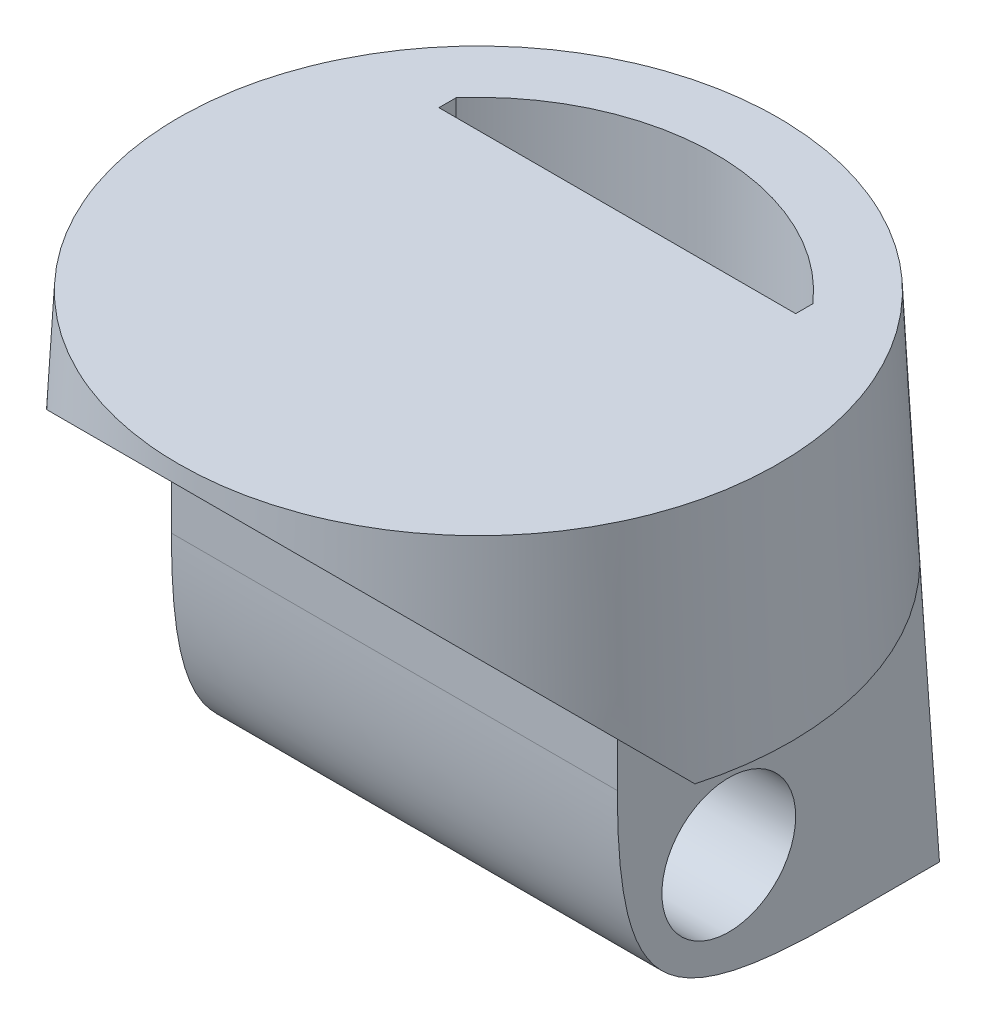
ISO-10303-21;
HEADER;
FILE_DESCRIPTION(('STEP AP214'),'2;1');
FILE_NAME('part.step','',(''),(''),'','','');
FILE_SCHEMA(('AUTOMOTIVE_DESIGN { 1 0 10303 214 1 1 1 1 }'));
ENDSEC;
DATA;
#1=APPLICATION_CONTEXT('core data for automotive mechanical design processes');
#2=APPLICATION_PROTOCOL_DEFINITION('international standard','automotive_design',2000,#1);
#3=PRODUCT_CONTEXT('',#1,'mechanical');
#4=PRODUCT('Part','Part','',(#3));
#5=PRODUCT_RELATED_PRODUCT_CATEGORY('part','',(#4));
#6=PRODUCT_DEFINITION_FORMATION('','',#4);
#7=PRODUCT_DEFINITION_CONTEXT('part definition',#1,'design');
#8=PRODUCT_DEFINITION('design','',#6,#7);
#9=PRODUCT_DEFINITION_SHAPE('','',#8);
#10=(LENGTH_UNIT() NAMED_UNIT(*) SI_UNIT(.MILLI.,.METRE.));
#11=(NAMED_UNIT(*) PLANE_ANGLE_UNIT() SI_UNIT($,.RADIAN.));
#12=(NAMED_UNIT(*) SI_UNIT($,.STERADIAN.) SOLID_ANGLE_UNIT());
#13=UNCERTAINTY_MEASURE_WITH_UNIT(LENGTH_MEASURE(1.E-05),#10,'distance_accuracy_value','');
#14=(GEOMETRIC_REPRESENTATION_CONTEXT(3) GLOBAL_UNCERTAINTY_ASSIGNED_CONTEXT((#13)) GLOBAL_UNIT_ASSIGNED_CONTEXT((#10,
#11,#12)) REPRESENTATION_CONTEXT('',''));
#15=CARTESIAN_POINT('',(0.,0.,0.));
#16=DIRECTION('',(0.,0.,1.));
#17=DIRECTION('',(1.,0.,0.));
#18=AXIS2_PLACEMENT_3D('',#15,#16,#17);
#19=CARTESIAN_POINT('',(0.,0.,0.));
#20=DIRECTION('',(0.,-1.,0.));
#21=DIRECTION('',(0.,0.,1.));
#22=AXIS2_PLACEMENT_3D('',#19,#20,#21);
#23=CONICAL_SURFACE('',#22,7.,0.05235987755983);
#24=CARTESIAN_POINT('',(0.,5.26167978121472,6.72424704736806));
#25=CARTESIAN_POINT('',(0.110942728021887,5.26167978121472,6.72425561113624));
#26=CARTESIAN_POINT('',(0.221891155148479,5.26167978121472,6.72160473014573));
#27=CARTESIAN_POINT('',(0.442732676543793,5.26167978121472,6.71093228312389));
#28=CARTESIAN_POINT('',(0.552627641657034,5.26167978121472,6.70294928173495));
#29=CARTESIAN_POINT('',(0.771363654731731,5.26167978121472,6.68161463954479));
#30=CARTESIAN_POINT('',(0.880207229494802,5.26167978121472,6.66828900488056));
#31=CARTESIAN_POINT('',(1.09683915887448,5.26167978121472,6.63628475885055));
#32=CARTESIAN_POINT('',(1.20462941328324,5.26167978121472,6.61761901257352));
#33=CARTESIAN_POINT('',(1.41915578304446,5.26167978121472,6.57494712367703));
#34=CARTESIAN_POINT('',(1.52589182154024,5.26167978121472,6.55094059465045));
#35=CARTESIAN_POINT('',(1.73831194294136,5.26167978121472,6.49760085148843));
#36=CARTESIAN_POINT('',(1.84399266702412,5.26167978121472,6.4682542682092));
#37=CARTESIAN_POINT('',(2.05430562913626,5.26167978121472,6.404246597412));
#38=CARTESIAN_POINT('',(2.15893003707987,5.26167978121472,6.36955980087811));
#39=CARTESIAN_POINT('',(2.36713529762936,5.26167978121472,6.29488647823328));
#40=CARTESIAN_POINT('',(2.47070284530368,5.26167978121472,6.25486290503497));
#41=CARTESIAN_POINT('',(2.67573825191976,5.26167978121472,6.16995650032226));
#42=CARTESIAN_POINT('',(2.77720758688271,5.26167978121472,6.12507723345685));
#43=CARTESIAN_POINT('',(2.97712081392778,5.26167978121472,6.03074488578233));
#44=CARTESIAN_POINT('',(3.07558105913284,5.26167978121472,5.98132650048824));
#45=CARTESIAN_POINT('',(3.26947948025403,5.26167978121472,5.87793041763173));
#46=CARTESIAN_POINT('',(3.36492977395466,5.26167978121472,5.82397545438175));
#47=CARTESIAN_POINT('',(3.55281277811242,5.26167978121472,5.71151772908768));
#48=CARTESIAN_POINT('',(3.64525197282162,5.26167978121472,5.65302580314596));
#49=CARTESIAN_POINT('',(3.8271186999097,5.26167978121472,5.53150628714349));
#50=CARTESIAN_POINT('',(3.91654579452273,5.26167978121472,5.46847804193316));
#51=CARTESIAN_POINT('',(4.09239561118286,5.26167978121472,5.3378974991177));
#52=CARTESIAN_POINT('',(4.17880987468971,5.26167978121472,5.27033381349376));
#53=CARTESIAN_POINT('',(4.34864182510469,5.26167978121472,5.13069227429559));
#54=CARTESIAN_POINT('',(4.43204218517096,5.26167978121472,5.05859335677305));
#55=CARTESIAN_POINT('',(4.59585691015315,5.26167978121472,4.90989345188996));
#56=CARTESIAN_POINT('',(4.67624454593207,5.26167978121472,4.83326304385244));
#57=CARTESIAN_POINT('',(4.83319962284555,5.26167978121472,4.67633551608948));
#58=CARTESIAN_POINT('',(4.90977074253287,5.26167978121472,4.59604207580936));
#59=CARTESIAN_POINT('',(5.05836722153953,5.26167978121472,4.43238703703443));
#60=CARTESIAN_POINT('',(5.13042096863821,5.26167978121472,4.34905123700594));
#61=CARTESIAN_POINT('',(5.26999173907563,5.26167978121472,4.17932395476792));
#62=CARTESIAN_POINT('',(5.33752865746611,5.26167978121472,4.09294883868395));
#63=CARTESIAN_POINT('',(5.46807422302938,5.26167978121472,3.91715174689228));
#64=CARTESIAN_POINT('',(5.53109300771437,5.26167978121472,3.82773730106944));
#65=CARTESIAN_POINT('',(5.65261244586664,5.26167978121472,3.64587052092163));
#66=CARTESIAN_POINT('',(5.7111124441769,5.26167978121472,3.55341774884391));
#67=CARTESIAN_POINT('',(5.82360548111114,5.26167978121472,3.36548224742048));
#68=CARTESIAN_POINT('',(5.87758634705293,5.26167978121472,3.26999223385669));
#69=CARTESIAN_POINT('',(5.98105210625748,5.26167978121472,3.0759883999641));
#70=CARTESIAN_POINT('',(6.03051293078364,5.26167978121472,2.97746174978187));
#71=CARTESIAN_POINT('',(6.12495301238798,5.26167978121472,2.77739177000749));
#72=CARTESIAN_POINT('',(6.16989631615714,5.26167978121472,2.67583148805114));
#73=CARTESIAN_POINT('',(6.25485033426793,5.26167978121472,2.47078524948619));
#74=CARTESIAN_POINT('',(6.29486585521192,5.26167978121472,2.3673012845206));
#75=CARTESIAN_POINT('',(6.36952302881178,5.26167978121472,2.15923833318493));
#76=CARTESIAN_POINT('',(6.40420078100166,5.26167978121472,2.05467231795705));
#77=CARTESIAN_POINT('',(6.4681955402117,5.26167978121472,1.8444533342986));
#78=CARTESIAN_POINT('',(6.49753719090807,5.26167978121472,1.73880787268973));
#79=CARTESIAN_POINT('',(6.55087093250581,5.26167978121472,1.52643491259894));
#80=CARTESIAN_POINT('',(6.57487527080941,5.26167978121472,1.41971049136554));
#81=CARTESIAN_POINT('',(6.61754718886033,5.26167978121472,1.20518401985197));
#82=CARTESIAN_POINT('',(6.63621399580077,5.26167978121472,1.09738181585874));
#83=CARTESIAN_POINT('',(6.66822420742634,5.26167978121472,0.880702831170232));
#84=CARTESIAN_POINT('',(6.68155357846997,5.26167978121472,0.771823979018759));
#85=CARTESIAN_POINT('',(6.70290142266868,5.26167978121472,0.552993175791986));
#86=CARTESIAN_POINT('',(6.71089274943831,5.26167978121472,0.443038582184442));
#87=CARTESIAN_POINT('',(6.72158054130782,5.26167978121472,0.222057368219727));
#88=CARTESIAN_POINT('',(6.72423730249246,5.26167978121472,0.111028844655952));
#89=CARTESIAN_POINT('',(6.72425678266184,5.26167978121472,-0.110919673616693));
#90=CARTESIAN_POINT('',(6.72162470453689,5.26167978121472,-0.221839667694435));
#91=CARTESIAN_POINT('',(6.71097669481563,5.26167978121472,-0.442634833351564));
#92=CARTESIAN_POINT('',(6.70299907868115,5.26167978121472,-0.552511835851726));
#93=CARTESIAN_POINT('',(6.68167520468847,5.26167978121472,-0.771218586307197));
#94=CARTESIAN_POINT('',(6.66835458735464,5.26167978121472,-0.880050829590164));
#95=CARTESIAN_POINT('',(6.63635692629991,5.26167978121472,-1.09666779997249));
#96=CARTESIAN_POINT('',(6.61769237531529,5.26167978121472,-1.20445437094285));
#97=CARTESIAN_POINT('',(6.57502036056355,5.26167978121472,-1.41898082322143));
#98=CARTESIAN_POINT('',(6.55101212399252,5.26167978121472,-1.52572055080162));
#99=CARTESIAN_POINT('',(6.49766624576282,5.26167978121472,-1.73815560753615));
#100=CARTESIAN_POINT('',(6.46831484599802,5.26167978121472,-1.84384748002438));
#101=CARTESIAN_POINT('',(6.40429475943052,5.26167978121472,-2.05419024649993));
#102=CARTESIAN_POINT('',(6.36959998138461,5.26167978121472,-2.15883319339675));
#103=CARTESIAN_POINT('',(6.29490836409253,5.26167978121472,-2.36708325492494));
#104=CARTESIAN_POINT('',(6.25487411488607,5.26167978121472,-2.47067693385938));
#105=CARTESIAN_POINT('',(6.16995609143522,5.26167978121472,-2.67573808190008));
#106=CARTESIAN_POINT('',(6.12507712427624,5.26167978121472,-2.77720754148319));
#107=CARTESIAN_POINT('',(6.03074499418986,5.26167978121472,-2.97712085900243));
#108=CARTESIAN_POINT('',(5.98132652947038,5.26167978121472,-3.07558107118124));
#109=CARTESIAN_POINT('',(5.87793038878922,5.26167978121472,-3.26947946825771));
#110=CARTESIAN_POINT('',(5.82397544666264,5.26167978121472,-3.36492977074139));
#111=CARTESIAN_POINT('',(5.71151773679163,5.26167978121472,-3.55281278131186));
#112=CARTESIAN_POINT('',(5.65302580521165,5.26167978121472,-3.64525197367653));
#113=CARTESIAN_POINT('',(5.53150628508043,5.26167978121472,-3.82711869904784));
#114=CARTESIAN_POINT('',(5.46847804138063,5.26167978121472,-3.91654579428904));
#115=CARTESIAN_POINT('',(5.33789749967441,5.26167978121472,-4.09239561141075));
#116=CARTESIAN_POINT('',(5.27033381364418,5.26167978121472,-4.17880987474891));
#117=CARTESIAN_POINT('',(5.13069227414659,5.26167978121472,-4.34864182504007));
#118=CARTESIAN_POINT('',(5.05859335673352,5.26167978121472,-4.43204218515229));
#119=CARTESIAN_POINT('',(4.909893451931,5.26167978121472,-4.59585691016901));
#120=CARTESIAN_POINT('',(4.83326304386354,5.26167978121472,-4.67624454593609));
#121=CARTESIAN_POINT('',(4.67633551607891,5.26167978121472,-4.83319962284103));
#122=CARTESIAN_POINT('',(4.59604207580706,5.26167978121472,-4.90977074253166));
#123=CARTESIAN_POINT('',(4.43238703703843,5.26167978121472,-5.05836722154072));
#124=CARTESIAN_POINT('',(4.34905123700803,5.26167978121472,-5.13042096863852));
#125=CARTESIAN_POINT('',(4.17932395476881,5.26167978121472,-5.26999173907529));
#126=CARTESIAN_POINT('',(4.09294883868552,5.26167978121472,-5.33752865746601));
#127=CARTESIAN_POINT('',(3.91715174689444,5.26167978121472,-5.46807422302943));
#128=CARTESIAN_POINT('',(3.82773730107149,5.26167978121472,-5.53109300771436));
#129=CARTESIAN_POINT('',(3.64587052092357,5.26167978121472,-5.65261244586659));
#130=CARTESIAN_POINT('',(3.55341774884584,5.26167978121472,-5.71111244417686));
#131=CARTESIAN_POINT('',(3.36548224742227,5.26167978121472,-5.82360548111112));
#132=CARTESIAN_POINT('',(3.26999223385834,5.26167978121472,-5.8775863470529));
#133=CARTESIAN_POINT('',(3.07598839996541,5.26167978121472,-5.98105210625746));
#134=CARTESIAN_POINT('',(2.97746174978298,5.26167978121472,-6.03051293078363));
#135=CARTESIAN_POINT('',(2.7773917700081,5.26167978121472,-6.12495301238798));
#136=CARTESIAN_POINT('',(2.67583148805145,5.26167978121472,-6.16989631615714));
#137=CARTESIAN_POINT('',(2.47078524948592,5.26167978121472,-6.25485033426792));
#138=CARTESIAN_POINT('',(2.36730128452005,5.26167978121472,-6.29486585521191));
#139=CARTESIAN_POINT('',(2.1592383331839,5.26167978121472,-6.36952302881177));
#140=CARTESIAN_POINT('',(2.05467231795582,5.26167978121472,-6.40420078100164));
#141=CARTESIAN_POINT('',(1.84445333429705,5.26167978121472,-6.46819554021168));
#142=CARTESIAN_POINT('',(1.73880787268807,5.26167978121472,-6.49753719090806));
#143=CARTESIAN_POINT('',(1.52643491259712,5.26167978121472,-6.5508709325058));
#144=CARTESIAN_POINT('',(1.41971049136367,5.26167978121472,-6.5748752708094));
#145=CARTESIAN_POINT('',(1.20518401985011,5.26167978121472,-6.61754718886032));
#146=CARTESIAN_POINT('',(1.09738181585691,5.26167978121472,-6.63621399580076));
#147=CARTESIAN_POINT('',(0.880702831168568,5.26167978121472,-6.66822420742633));
#148=CARTESIAN_POINT('',(0.771823979017214,5.26167978121472,-6.68155357846997));
#149=CARTESIAN_POINT('',(0.552993175790759,5.26167978121472,-6.70290142266868));
#150=CARTESIAN_POINT('',(0.443038582183412,5.26167978121472,-6.71089274943831));
#151=CARTESIAN_POINT('',(0.222057368219173,5.26167978121472,-6.72158054130782));
#152=CARTESIAN_POINT('',(0.111028844655675,5.26167978121472,-6.72423730249246));
#153=CARTESIAN_POINT('',(-0.110919673616694,5.26167978121472,-6.72425678266184));
#154=CARTESIAN_POINT('',(-0.221839667694436,5.26167978121472,-6.72162470453689));
#155=CARTESIAN_POINT('',(-0.442634833351565,5.26167978121472,-6.71097669481563));
#156=CARTESIAN_POINT('',(-0.552511835851727,5.26167978121472,-6.70299907868115));
#157=CARTESIAN_POINT('',(-0.771218586307198,5.26167978121472,-6.68167520468847));
#158=CARTESIAN_POINT('',(-0.880050829590164,5.26167978121472,-6.66835458735464));
#159=CARTESIAN_POINT('',(-1.09666779997249,5.26167978121472,-6.63635692629991));
#160=CARTESIAN_POINT('',(-1.20445437094285,5.26167978121472,-6.61769237531529));
#161=CARTESIAN_POINT('',(-1.41898082322142,5.26167978121472,-6.57502036056355));
#162=CARTESIAN_POINT('',(-1.52572055080161,5.26167978121472,-6.55101212399252));
#163=CARTESIAN_POINT('',(-1.73815560753614,5.26167978121472,-6.49766624576282));
#164=CARTESIAN_POINT('',(-1.84384748002437,5.26167978121472,-6.46831484599802));
#165=CARTESIAN_POINT('',(-2.05419024649992,5.26167978121472,-6.40429475943053));
#166=CARTESIAN_POINT('',(-2.15883319339674,5.26167978121472,-6.36959998138462));
#167=CARTESIAN_POINT('',(-2.36708325492493,5.26167978121472,-6.29490836409253));
#168=CARTESIAN_POINT('',(-2.47067693385937,5.26167978121472,-6.25487411488607));
#169=CARTESIAN_POINT('',(-2.67573808190037,5.26167978121472,-6.16995609143511));
#170=CARTESIAN_POINT('',(-2.77720754148377,5.26167978121472,-6.125077124276));
#171=CARTESIAN_POINT('',(-2.97712085900352,5.26167978121472,-6.03074499418942));
#172=CARTESIAN_POINT('',(-3.07558107118254,5.26167978121472,-5.98132652946985));
#173=CARTESIAN_POINT('',(-3.26947946825934,5.26167978121472,-5.87793038878855));
#174=CARTESIAN_POINT('',(-3.36492977074315,5.26167978121472,-5.82397544666192));
#175=CARTESIAN_POINT('',(-3.5528127813138,5.26167978121472,-5.71151773679084));
#176=CARTESIAN_POINT('',(-3.64525197367851,5.26167978121472,-5.65302580521085));
#177=CARTESIAN_POINT('',(-3.82711869904982,5.26167978121472,-5.53150628507962));
#178=CARTESIAN_POINT('',(-3.91654579429098,5.26167978121472,-5.46847804137984));
#179=CARTESIAN_POINT('',(-4.09239561141252,5.26167978121472,-5.33789749967369));
#180=CARTESIAN_POINT('',(-4.17880987475056,5.26167978121472,-5.27033381364351));
#181=CARTESIAN_POINT('',(-4.34864182504138,5.26167978121472,-5.13069227414606));
#182=CARTESIAN_POINT('',(-4.4320421851534,5.26167978121472,-5.05859335673309));
#183=CARTESIAN_POINT('',(-4.5958569101696,5.26167978121472,-4.90989345193077));
#184=CARTESIAN_POINT('',(-4.67624454593638,5.26167978121472,-4.83326304386342));
#185=CARTESIAN_POINT('',(-4.83319962284107,5.26167978121472,-4.67633551607869));
#186=CARTESIAN_POINT('',(-4.90977074253173,5.26167978121472,-4.59604207580663));
#187=CARTESIAN_POINT('',(-5.05836722154085,5.26167978121472,-4.43238703703763));
#188=CARTESIAN_POINT('',(-5.13042096863868,5.26167978121472,-4.34905123700709));
#189=CARTESIAN_POINT('',(-5.26999173907549,5.26167978121472,-4.17932395476763));
#190=CARTESIAN_POINT('',(-5.33752865746622,5.26167978121472,-4.09294883868425));
#191=CARTESIAN_POINT('',(-5.46807422302967,5.26167978121472,-3.91715174689305));
#192=CARTESIAN_POINT('',(-5.53109300771461,5.26167978121472,-3.82773730107007));
#193=CARTESIAN_POINT('',(-5.65261244586684,5.26167978121472,-3.64587052092215));
#194=CARTESIAN_POINT('',(-5.7111124441771,5.26167978121472,-3.55341774884445));
#195=CARTESIAN_POINT('',(-5.82360548111134,5.26167978121472,-3.36548224742101));
#196=CARTESIAN_POINT('',(-5.87758634705311,5.26167978121472,-3.26999223385717));
#197=CARTESIAN_POINT('',(-5.98105210625762,5.26167978121472,-3.07598839996447));
#198=CARTESIAN_POINT('',(-6.03051293078377,5.26167978121472,-2.9774617497822));
#199=CARTESIAN_POINT('',(-6.12495301238805,5.26167978121472,-2.77739177000768));
#200=CARTESIAN_POINT('',(-6.16989631615717,5.26167978121472,-2.67583148805124));
#201=CARTESIAN_POINT('',(-6.25485033426793,5.26167978121472,-2.47078524948604));
#202=CARTESIAN_POINT('',(-6.29486585521192,5.26167978121472,-2.36730128452029));
#203=CARTESIAN_POINT('',(-6.36952302881177,5.26167978121472,-2.15923833318434));
#204=CARTESIAN_POINT('',(-6.40420078100165,5.26167978121472,-2.05467231795635));
#205=CARTESIAN_POINT('',(-6.46819554021169,5.26167978121472,-1.84445333429771));
#206=CARTESIAN_POINT('',(-6.49753719090807,5.26167978121472,-1.73880787268878));
#207=CARTESIAN_POINT('',(-6.55087093250581,5.26167978121472,-1.5264349125979));
#208=CARTESIAN_POINT('',(-6.5748752708094,5.26167978121472,-1.41971049136447));
#209=CARTESIAN_POINT('',(-6.61754718886032,5.26167978121472,-1.2051840198509));
#210=CARTESIAN_POINT('',(-6.63621399580076,5.26167978121472,-1.09738181585769));
#211=CARTESIAN_POINT('',(-6.66822420742634,5.26167978121472,-0.880702831169276));
#212=CARTESIAN_POINT('',(-6.68155357846997,5.26167978121472,-0.77182397901787));
#213=CARTESIAN_POINT('',(-6.70290142266868,5.26167978121472,-0.552993175791278));
#214=CARTESIAN_POINT('',(-6.71089274943831,5.26167978121472,-0.443038582183846));
#215=CARTESIAN_POINT('',(-6.72158054130782,5.26167978121472,-0.222057368219401));
#216=CARTESIAN_POINT('',(-6.72423730249246,5.26167978121472,-0.111028844655783));
#217=CARTESIAN_POINT('',(-6.72425678266184,5.26167978121472,0.110919673616407));
#218=CARTESIAN_POINT('',(-6.72162470453689,5.26167978121472,0.221839667693852));
#219=CARTESIAN_POINT('',(-6.71097669481563,5.26167978121472,0.44263483335047));
#220=CARTESIAN_POINT('',(-6.70299907868115,5.26167978121472,0.552511835850419));
#221=CARTESIAN_POINT('',(-6.68167520468847,5.26167978121472,0.771218586305549));
#222=CARTESIAN_POINT('',(-6.66835458735464,5.26167978121472,0.880050829588387));
#223=CARTESIAN_POINT('',(-6.6363569262999,5.26167978121472,1.09666779997054));
#224=CARTESIAN_POINT('',(-6.61769237531528,5.26167978121472,1.20445437094085));
#225=CARTESIAN_POINT('',(-6.57502036056354,5.26167978121472,1.41898082321943));
#226=CARTESIAN_POINT('',(-6.55101212399251,5.26167978121472,1.52572055079966));
#227=CARTESIAN_POINT('',(-6.49766624576281,5.26167978121472,1.73815560753436));
#228=CARTESIAN_POINT('',(-6.46831484599801,5.26167978121472,1.84384748002271));
#229=CARTESIAN_POINT('',(-6.40429475943051,5.26167978121472,2.0541902464986));
#230=CARTESIAN_POINT('',(-6.3695999813846,5.26167978121472,2.15883319339563));
#231=CARTESIAN_POINT('',(-6.29490836409253,5.26167978121472,2.36708325492433));
#232=CARTESIAN_POINT('',(-6.25487411488607,5.26167978121472,2.47067693385907));
#233=CARTESIAN_POINT('',(-6.16995609143528,5.26167978121472,2.67573808190025));
#234=CARTESIAN_POINT('',(-6.12507712427635,5.26167978121472,2.77720754148355));
#235=CARTESIAN_POINT('',(-6.03074499419006,5.26167978121472,2.9771208590031));
#236=CARTESIAN_POINT('',(-5.98132652947061,5.26167978121472,3.07558107118204));
#237=CARTESIAN_POINT('',(-5.87793038878951,5.26167978121472,3.26947946825873));
#238=CARTESIAN_POINT('',(-5.82397544666296,5.26167978121472,3.3649297707425));
#239=CARTESIAN_POINT('',(-5.71151773679196,5.26167978121472,3.55281278131305));
#240=CARTESIAN_POINT('',(-5.65302580521197,5.26167978121472,3.64525197367771));
#241=CARTESIAN_POINT('',(-5.5315062850808,5.26167978121472,3.82711869904912));
#242=CARTESIAN_POINT('',(-5.46847804138105,5.26167978121472,3.91654579429045));
#243=CARTESIAN_POINT('',(-5.33789749967463,5.26167978121472,4.09239561141165));
#244=CARTESIAN_POINT('',(-5.27033381364414,5.26167978121472,4.17880987474917));
#245=CARTESIAN_POINT('',(-5.13069227414715,5.26167978121472,4.34864182504166));
#246=CARTESIAN_POINT('',(-5.05859335673493,5.26167978121472,4.43204218515586));
#247=CARTESIAN_POINT('',(-4.90989345192991,5.26167978121472,4.59585691016646));
#248=CARTESIAN_POINT('',(-4.83326304385906,5.26167978121472,4.67624454592536));
#249=CARTESIAN_POINT('',(-4.67633551608311,5.26167978121472,4.83319962285202));
#250=CARTESIAN_POINT('',(-4.59604207582329,5.26167978121472,4.90977074257249));
#251=CARTESIAN_POINT('',(-4.43238703702031,5.26167978121472,5.05836722150082));
#252=CARTESIAN_POINT('',(-4.34905123694394,5.26167978121472,5.13042096848905));
#253=CARTESIAN_POINT('',(-4.1793239548291,5.26167978121472,5.26999173922521));
#254=CARTESIAN_POINT('',(-4.09294883891515,5.26167978121472,5.33752865802244));
#255=CARTESIAN_POINT('',(-3.91715174666095,5.26167978121472,5.46807422247575));
#256=CARTESIAN_POINT('',(-3.82773730020742,5.26167978121472,5.53109300564852));
#257=CARTESIAN_POINT('',(-3.64587052178306,5.26167978121472,5.65261244793431));
#258=CARTESIAN_POINT('',(-3.55341775205991,5.26167978121472,5.71111245189136));
#259=CARTESIAN_POINT('',(-3.3654822441954,5.26167978121472,5.82360547337795));
#260=CARTESIAN_POINT('',(-3.26999222180682,5.26167978121472,5.87758631815541));
#261=CARTESIAN_POINT('',(-3.07598841207425,5.26167978121472,5.981052135302));
#262=CARTESIAN_POINT('',(-2.97746179508811,5.26167978121472,6.03051303944119));
#263=CARTESIAN_POINT('',(-2.77739172436499,5.26167978121472,6.12495290292534));
#264=CARTESIAN_POINT('',(-2.67583131709523,5.26167978121472,6.16989590615866));
#265=CARTESIAN_POINT('',(-2.47075932554482,5.26167978121472,6.25486155545969));
#266=CARTESIAN_POINT('',(-2.36724921736588,5.26167978121472,6.29488776393636));
#267=CARTESIAN_POINT('',(-2.15914144187055,5.26167978121472,6.36956325610888));
#268=CARTESIAN_POINT('',(-2.05455687699913,5.26167978121472,6.40424900346502));
#269=CARTESIAN_POINT('',(-1.84430807931057,5.26167978121472,6.46825617983682));
#270=CARTESIAN_POINT('',(-1.73865147045061,5.26167978121472,6.49760263543531));
#271=CARTESIAN_POINT('',(-1.52626354962568,5.26167978121472,6.55094256530485));
#272=CARTESIAN_POINT('',(-1.41953541291674,5.26167978121472,6.57494867611077));
#273=CARTESIAN_POINT('',(-1.20500892588706,5.26167978121472,6.61762054752791));
#274=CARTESIAN_POINT('',(-1.0972104987108,5.26167978121472,6.63628592171901));
#275=CARTESIAN_POINT('',(-0.880546229559371,5.26167978121472,6.66829018606948));
#276=CARTESIAN_POINT('',(-0.771678370934932,5.26167978121472,6.68161541727282));
#277=CARTESIAN_POINT('',(-0.552877784845727,5.26167978121472,6.70295006245663));
#278=CARTESIAN_POINT('',(-0.44294245429558,5.26167978121472,6.71093267459781));
#279=CARTESIAN_POINT('',(-0.222004080143426,5.26167978121472,6.72160510496806));
#280=CARTESIAN_POINT('',(-0.110999128676492,5.26167978121472,6.72425558159047));
#281=CARTESIAN_POINT('',(0.,5.26167978121472,6.72424704736806));
#282=B_SPLINE_CURVE_WITH_KNOTS('',3,(#24,#25,#26,#27,#28,#29,#30,#31,#32,#33,#34,#35,#36,#37,
#38,#39,#40,#41,#42,#43,#44,#45,#46,#47,#48,#49,#50,#51,#52,#53,#54,#55,#56,#57,#58,#59,#60,#61,
#62,#63,#64,#65,#66,#67,#68,#69,#70,#71,#72,#73,#74,#75,#76,#77,#78,#79,#80,#81,#82,#83,#84,#85,
#86,#87,#88,#89,#90,#91,#92,#93,#94,#95,#96,#97,#98,#99,#100,#101,#102,#103,#104,#105,#106,#107,
#108,#109,#110,#111,#112,#113,#114,#115,#116,#117,#118,#119,#120,#121,#122,#123,#124,#125,#126,
#127,#128,#129,#130,#131,#132,#133,#134,#135,#136,#137,#138,#139,#140,#141,#142,#143,#144,#145,
#146,#147,#148,#149,#150,#151,#152,#153,#154,#155,#156,#157,#158,#159,#160,#161,#162,#163,#164,
#165,#166,#167,#168,#169,#170,#171,#172,#173,#174,#175,#176,#177,#178,#179,#180,#181,#182,#183,
#184,#185,#186,#187,#188,#189,#190,#191,#192,#193,#194,#195,#196,#197,#198,#199,#200,#201,#202,
#203,#204,#205,#206,#207,#208,#209,#210,#211,#212,#213,#214,#215,#216,#217,#218,#219,#220,#221,
#222,#223,#224,#225,#226,#227,#228,#229,#230,#231,#232,#233,#234,#235,#236,#237,#238,#239,#240,
#241,#242,#243,#244,#245,#246,#247,#248,#249,#250,#251,#252,#253,#254,#255,#256,#257,#258,#259,
#260,#261,#262,#263,#264,#265,#266,#267,#268,#269,#270,#271,#272,#273,#274,#275,#276,#277,#278,
#279,#280,#281),.UNSPECIFIED.,.F.,.F.,(4,2,2,2,2,2,2,2,2,2,2,2,2,2,2,2,2,2,2,2,2,2,2,2,2,2,2,2,
2,2,2,2,2,2,2,2,2,2,2,2,2,2,2,2,2,2,2,2,2,2,2,2,2,2,2,2,2,2,2,2,2,2,2,2,2,2,2,2,2,2,2,2,2,2,2,2,
2,2,2,2,2,2,2,2,2,2,2,2,2,2,2,2,2,2,2,2,2,2,2,2,2,2,2,2,2,2,2,2,2,2,2,2,2,2,2,2,2,2,2,2,2,2,2,2,
2,2,2,2,4),(0.,0.332804492859096,0.663227666095237,0.992061607877566,1.32010991840087,
1.64818197103366,1.97708696386993,2.3076279776927,2.64059625581804,2.97332173374558,
3.30368747417217,3.63248643602224,3.9605229404853,4.28860691645424,4.61754794216463,
4.94814929966913,5.28120225769953,5.61392773562636,5.94429347605243,6.2730924379022,
6.60112894236516,6.9292129183342,7.25815394404489,7.58875530154987,7.92180825958094,
8.25453373750781,8.58489947793391,8.91369843978369,9.24173494424665,9.56981892021568,
9.89875994592638,10.2293613034314,10.5624142614625,10.89513973939,11.2255054798165,
11.5543044416665,11.8823409461296,12.2104249220985,12.539365947809,12.8699673053135,
13.203020263344,13.5357457412699,13.8661114816953,14.1949104435446,14.5229469480075,
14.8510309239766,15.1799719496877,15.5105733071933,15.8436262652253,16.1763517431515,
16.5067174835771,16.8355164454265,17.1635529498894,17.4916369258585,17.8205779515696,
18.1511793090751,18.484232267107,18.8169577450346,19.1473234854613,19.4761224473114,
19.8041589517745,20.1322429277434,20.4611839534538,20.7917853109582,21.1248382689885,
21.4575637469159,21.7879294873425,22.1167284491925,22.4447649536556,22.7728489296245,
23.1017899553349,23.4323913128395,23.7654442708699,24.0981697487968,24.4285354892229,
24.7573344510726,25.0853709555356,25.4134549315046,25.7423959572153,26.0729973147203,
26.4060502727514,26.7387757506781,27.0691414911041,27.3979404529538,27.7259769574167,
28.0540609333858,28.3830019590965,28.7136033166016,29.0466562746329,29.3793817525602,
29.7097474929866,30.0385464548366,30.3665829592996,30.6946669352686,31.0236079609791,
31.3542093184838,31.6872622765144,32.019987754441,32.3503534948669,32.6791524567166,
33.0071889611795,33.3352729371486,33.6642139628594,33.9948153203645,34.3278682783958,
34.6605937563221,34.9909594967478,35.3197584585974,35.6477949630602,35.9758789390294,
36.3048199647403,36.6354213222457,36.9684742802773,37.3011997582045,37.6315654986309,
37.9603644604808,38.2884009649438,38.6164849409128,38.9454259666233,39.2760273241281,
39.6090802821589,39.9418904889597,40.2723166075013,40.6011516223235,40.9292000565929,
41.2572722202626,41.586178247903,41.9167221429552,42.2496960446191),.UNSPECIFIED.);
#283=CARTESIAN_POINT('',(0.,5.26167978121472,6.72424704736806));
#284=VERTEX_POINT('',#283);
#285=EDGE_CURVE('E447',#284,#284,#282,.T.);
#286=ORIENTED_EDGE('',*,*,#285,.F.);
#287=EDGE_LOOP('',(#286));
#288=FACE_BOUND('',#287,.T.);
#289=CARTESIAN_POINT('',(0.,0.,0.));
#290=DIRECTION('',(0.,1.,0.));
#291=DIRECTION('',(0.,0.,1.));
#292=AXIS2_PLACEMENT_3D('',#289,#290,#291);
#293=CIRCLE('',#292,7.);
#294=CARTESIAN_POINT('',(5.,0.,-4.89897948556636));
#295=VERTEX_POINT('',#294);
#296=CARTESIAN_POINT('',(6.74112647092629,0.,1.88605776766695));
#297=VERTEX_POINT('',#296);
#298=EDGE_CURVE('E263',#295,#297,#293,.F.);
#299=ORIENTED_EDGE('',*,*,#298,.F.);
#300=CARTESIAN_POINT('',(5.,9.15553717672686,-4.18482130401796));
#301=CARTESIAN_POINT('',(5.,8.0128001138313,-4.27810313995923));
#302=CARTESIAN_POINT('',(5.,6.86992031747899,-4.36961733640065));
#303=CARTESIAN_POINT('',(5.,4.58392440974111,-4.54961743613816));
#304=CARTESIAN_POINT('',(5.,3.44080829884516,-4.63810334564632));
#305=CARTESIAN_POINT('',(5.,1.15439740259885,-4.81255323050272));
#306=CARTESIAN_POINT('',(5.,0.0111026194599385,-4.89851723490924));
#307=CARTESIAN_POINT('',(5.,-2.27564785718321,-5.0682836024466));
#308=CARTESIAN_POINT('',(5.,-3.41910355077997,-5.15208596432946));
#309=CARTESIAN_POINT('',(5.,-6.84965680108489,-5.40070995317151));
#310=CARTESIAN_POINT('',(5.,-9.13695617877218,-5.56274966868752));
#311=CARTESIAN_POINT('',(5.,-12.5682133786608,-5.80154955949978));
#312=CARTESIAN_POINT('',(5.,-13.7120240059957,-5.88044003712885));
#313=CARTESIAN_POINT('',(5.,-15.9997318316355,-6.03695082309413));
#314=CARTESIAN_POINT('',(5.,-17.1436290299137,-6.11457113182166));
#315=CARTESIAN_POINT('',(5.,-18.2875640850226,-6.19163141921609));
#316=B_SPLINE_CURVE_WITH_KNOTS('',3,(#300,#301,#302,#303,#304,#305,#306,#307,#308,#309,#310,
#311,#312,#313,#314,#315),.UNSPECIFIED.,.F.,.F.,(4,2,2,2,2,2,2,4),(0.,3.4396105177493,
6.87921397922711,10.3187777927923,13.7583435920591,20.6374281019773,24.0770116804408,
27.516594199204),.UNSPECIFIED.);
#317=CARTESIAN_POINT('',(5.,-6.,-5.33864497523793));
#318=VERTEX_POINT('',#317);
#319=EDGE_CURVE('E207',#295,#318,#316,.T.);
#320=ORIENTED_EDGE('',*,*,#319,.T.);
#321=CARTESIAN_POINT('',(0.,-6.,0.));
#322=DIRECTION('',(0.,1.,0.));
#323=DIRECTION('',(0.,0.,1.));
#324=AXIS2_PLACEMENT_3D('',#321,#322,#323);
#325=CIRCLE('',#324,7.31444667569825);
#326=CARTESIAN_POINT('',(-5.,-6.,-5.33864497523793));
#327=VERTEX_POINT('',#326);
#328=EDGE_CURVE('E303',#318,#327,#325,.T.);
#329=ORIENTED_EDGE('',*,*,#328,.T.);
#330=CARTESIAN_POINT('',(-5.,9.15553717672686,-4.18482130401796));
#331=CARTESIAN_POINT('',(-5.,8.01280011383131,-4.27810313995922));
#332=CARTESIAN_POINT('',(-5.,6.86992031747899,-4.36961733640065));
#333=CARTESIAN_POINT('',(-5.,4.58392440974111,-4.54961743613816));
#334=CARTESIAN_POINT('',(-5.,3.44080829884516,-4.63810334564632));
#335=CARTESIAN_POINT('',(-5.,1.15439740259885,-4.81255323050272));
#336=CARTESIAN_POINT('',(-5.,0.0111026194599391,-4.89851723490924));
#337=CARTESIAN_POINT('',(-5.,-2.27564785718321,-5.0682836024466));
#338=CARTESIAN_POINT('',(-5.,-3.41910355077997,-5.15208596432946));
#339=CARTESIAN_POINT('',(-5.,-6.84965680108489,-5.40070995317151));
#340=CARTESIAN_POINT('',(-5.,-9.13695617877218,-5.56274966868751));
#341=CARTESIAN_POINT('',(-5.,-12.5682133786608,-5.80154955949978));
#342=CARTESIAN_POINT('',(-5.,-13.7120240059957,-5.88044003712885));
#343=CARTESIAN_POINT('',(-5.,-15.9997318316355,-6.03695082309413));
#344=CARTESIAN_POINT('',(-5.,-17.1436290299137,-6.11457113182166));
#345=CARTESIAN_POINT('',(-5.,-18.2875640850226,-6.19163141921609));
#346=B_SPLINE_CURVE_WITH_KNOTS('',3,(#330,#331,#332,#333,#334,#335,#336,#337,#338,#339,#340,
#341,#342,#343,#344,#345),.UNSPECIFIED.,.F.,.F.,(4,2,2,2,2,2,2,4),(0.,3.4396105177493,
6.87921397922711,10.3187777927923,13.7583435920591,20.6374281019773,24.0770116804408,
27.516594199204),.UNSPECIFIED.);
#347=CARTESIAN_POINT('',(-5.,0.,-4.89897948556636));
#348=VERTEX_POINT('',#347);
#349=EDGE_CURVE('E215',#348,#327,#346,.T.);
#350=ORIENTED_EDGE('',*,*,#349,.F.);
#351=CARTESIAN_POINT('',(0.,0.,0.));
#352=DIRECTION('',(0.,-1.,0.));
#353=DIRECTION('',(0.,0.,-1.));
#354=AXIS2_PLACEMENT_3D('',#351,#352,#353);
#355=CIRCLE('',#354,7.);
#356=CARTESIAN_POINT('',(-6.74112647092629,0.,1.88605776766695));
#357=VERTEX_POINT('',#356);
#358=EDGE_CURVE('E223',#348,#357,#355,.F.);
#359=ORIENTED_EDGE('',*,*,#358,.T.);
#360=CARTESIAN_POINT('',(0.,-2.25911705782544,-0.373059290158493));
#361=DIRECTION('',(0.,0.707106781186549,-0.707106781186546));
#362=DIRECTION('',(0.,-0.707106781186546,-0.707106781186549));
#363=AXIS2_PLACEMENT_3D('',#360,#361,#362);
#364=ELLIPSE('',#363,10.0669311871061,7.10861298207964);
#365=EDGE_CURVE('E162',#297,#357,#364,.F.);
#366=ORIENTED_EDGE('',*,*,#365,.F.);
#367=EDGE_LOOP('',(#299,#320,#329,#350,#359,#366));
#368=FACE_BOUND('',#367,.T.);
#369=ADVANCED_FACE('F43',(#288,#368),#23,.T.);
#370=CARTESIAN_POINT('',(0.,-6.,0.));
#371=DIRECTION('',(0.,1.,0.));
#372=DIRECTION('',(0.,0.,1.));
#373=AXIS2_PLACEMENT_3D('',#370,#371,#372);
#374=PLANE('',#373);
#375=CARTESIAN_POINT('',(-5.5,-6.,-3.11394223233305));
#376=CARTESIAN_POINT('',(-1.83333333333334,-6.,-3.11394223233305));
#377=CARTESIAN_POINT('',(1.83333333333333,-6.,-3.11394223233305));
#378=CARTESIAN_POINT('',(5.5,-6.,-3.11394223233305));
#379=(BOUNDED_CURVE() B_SPLINE_CURVE(3,(#375,#376,#377,#378),.UNSPECIFIED.,.F.,
.F.) B_SPLINE_CURVE_WITH_KNOTS((4,4),(-0.0055,0.0055),
.UNSPECIFIED.) CURVE() GEOMETRIC_REPRESENTATION_ITEM() RATIONAL_B_SPLINE_CURVE((1.,1.,1.,1.)) REPRESENTATION_ITEM(''));
#380=CARTESIAN_POINT('',(5.,-6.,-3.11394223233305));
#381=VERTEX_POINT('',#380);
#382=CARTESIAN_POINT('',(4.,-6.,-3.11394223233305));
#383=VERTEX_POINT('',#382);
#384=EDGE_CURVE('E161',#381,#383,#379,.F.);
#385=ORIENTED_EDGE('',*,*,#384,.T.);
#386=DIRECTION('',(0.,0.,1.));
#387=VECTOR('',#386,1.);
#388=CARTESIAN_POINT('',(4.,-6.,-3.11394223233305));
#389=LINE('',#388,#387);
#390=CARTESIAN_POINT('',(4.,-6.,-3.49904893776011));
#391=VERTEX_POINT('',#390);
#392=EDGE_CURVE('E64',#391,#383,#389,.T.);
#393=ORIENTED_EDGE('',*,*,#392,.F.);
#394=CARTESIAN_POINT('',(0.,-6.,0.));
#395=DIRECTION('',(0.,-1.,0.));
#396=DIRECTION('',(0.,0.,-1.));
#397=AXIS2_PLACEMENT_3D('',#394,#395,#396);
#398=CIRCLE('',#397,5.31444667569825);
#399=CARTESIAN_POINT('',(-4.,-6.,-3.49904893776011));
#400=VERTEX_POINT('',#399);
#401=EDGE_CURVE('E154',#400,#391,#398,.T.);
#402=ORIENTED_EDGE('',*,*,#401,.F.);
#403=DIRECTION('',(0.,0.,-1.));
#404=VECTOR('',#403,1.);
#405=CARTESIAN_POINT('',(-4.,-6.,-3.11394223233305));
#406=LINE('',#405,#404);
#407=CARTESIAN_POINT('',(-4.,-6.,-3.11394223233305));
#408=VERTEX_POINT('',#407);
#409=EDGE_CURVE('E129',#408,#400,#406,.T.);
#410=ORIENTED_EDGE('',*,*,#409,.F.);
#411=CARTESIAN_POINT('',(-5.5,-6.,-3.11394223233305));
#412=CARTESIAN_POINT('',(-1.83333333333334,-6.,-3.11394223233305));
#413=CARTESIAN_POINT('',(1.83333333333333,-6.,-3.11394223233305));
#414=CARTESIAN_POINT('',(5.5,-6.,-3.11394223233305));
#415=(BOUNDED_CURVE() B_SPLINE_CURVE(3,(#411,#412,#413,#414),.UNSPECIFIED.,.F.,
.F.) B_SPLINE_CURVE_WITH_KNOTS((4,4),(-0.0055,0.0055),
.UNSPECIFIED.) CURVE() GEOMETRIC_REPRESENTATION_ITEM() RATIONAL_B_SPLINE_CURVE((1.,1.,1.,1.)) REPRESENTATION_ITEM(''));
#416=CARTESIAN_POINT('',(-5.,-6.,-3.11394223233305));
#417=VERTEX_POINT('',#416);
#418=EDGE_CURVE('E150',#408,#417,#415,.F.);
#419=ORIENTED_EDGE('',*,*,#418,.T.);
#420=DIRECTION('',(0.,0.,1.));
#421=VECTOR('',#420,1.);
#422=CARTESIAN_POINT('',(-5.,-6.,-7.31444667569825));
#423=LINE('',#422,#421);
#424=EDGE_CURVE('E270',#327,#417,#423,.T.);
#425=ORIENTED_EDGE('',*,*,#424,.F.);
#426=ORIENTED_EDGE('',*,*,#328,.F.);
#427=DIRECTION('',(0.,0.,1.));
#428=VECTOR('',#427,1.);
#429=CARTESIAN_POINT('',(5.,-6.,-7.31444667569825));
#430=LINE('',#429,#428);
#431=EDGE_CURVE('E253',#318,#381,#430,.T.);
#432=ORIENTED_EDGE('',*,*,#431,.T.);
#433=EDGE_LOOP('',(#385,#393,#402,#410,#419,#425,#426,#432));
#434=FACE_BOUND('',#433,.T.);
#435=ADVANCED_FACE('F148',(#434),#374,.F.);
#436=CARTESIAN_POINT('',(-7.31444667569825,-6.,1.88605776766695));
#437=DIRECTION('',(0.,0.,-1.));
#438=DIRECTION('',(-1.,0.,0.));
#439=AXIS2_PLACEMENT_3D('',#436,#437,#438);
#440=PLANE('',#439);
#441=DIRECTION('',(0.,1.,0.));
#442=VECTOR('',#441,1.);
#443=CARTESIAN_POINT('',(-5.,0.,1.88605776766695));
#444=LINE('',#443,#442);
#445=CARTESIAN_POINT('',(-5.,-1.,1.88605776766695));
#446=VERTEX_POINT('',#445);
#447=CARTESIAN_POINT('',(-5.,0.,1.88605776766695));
#448=VERTEX_POINT('',#447);
#449=EDGE_CURVE('E272',#446,#448,#444,.T.);
#450=ORIENTED_EDGE('',*,*,#449,.F.);
#451=CARTESIAN_POINT('',(5.5,-1.,1.88605776766695));
#452=CARTESIAN_POINT('',(1.83333333333333,-1.,1.88605776766695));
#453=CARTESIAN_POINT('',(-1.83333333333334,-1.,1.88605776766695));
#454=CARTESIAN_POINT('',(-5.5,-1.,1.88605776766695));
#455=(BOUNDED_CURVE() B_SPLINE_CURVE(3,(#451,#452,#453,#454),.UNSPECIFIED.,.F.,
.F.) B_SPLINE_CURVE_WITH_KNOTS((4,4),(-0.0055,0.0055),
.UNSPECIFIED.) CURVE() GEOMETRIC_REPRESENTATION_ITEM() RATIONAL_B_SPLINE_CURVE((1.,1.,1.,1.)) REPRESENTATION_ITEM(''));
#456=CARTESIAN_POINT('',(5.,-1.,1.88605776766695));
#457=VERTEX_POINT('',#456);
#458=EDGE_CURVE('E310',#446,#457,#455,.F.);
#459=ORIENTED_EDGE('',*,*,#458,.T.);
#460=DIRECTION('',(0.,1.,0.));
#461=VECTOR('',#460,1.);
#462=CARTESIAN_POINT('',(5.,0.,1.88605776766695));
#463=LINE('',#462,#461);
#464=CARTESIAN_POINT('',(5.,0.,1.88605776766695));
#465=VERTEX_POINT('',#464);
#466=EDGE_CURVE('E245',#457,#465,#463,.T.);
#467=ORIENTED_EDGE('',*,*,#466,.T.);
#468=DIRECTION('',(1.,0.,0.));
#469=VECTOR('',#468,1.);
#470=CARTESIAN_POINT('',(-7.31444667569825,0.,1.88605776766695));
#471=LINE('',#470,#469);
#472=EDGE_CURVE('E294',#448,#465,#471,.T.);
#473=ORIENTED_EDGE('',*,*,#472,.F.);
#474=EDGE_LOOP('',(#450,#459,#467,#473));
#475=FACE_BOUND('',#474,.T.);
#476=ADVANCED_FACE('F295',(#475),#440,.F.);
#477=CARTESIAN_POINT('',(-7.31444667569825,0.,1.88605776766695));
#478=DIRECTION('',(0.,0.707106781186549,-0.707106781186546));
#479=DIRECTION('',(0.,0.707106781186546,0.707106781186549));
#480=AXIS2_PLACEMENT_3D('',#477,#478,#479);
#481=PLANE('',#480);
#482=ORIENTED_EDGE('',*,*,#365,.T.);
#483=EDGE_CURVE('E287',#357,#448,#471,.T.);
#484=ORIENTED_EDGE('',*,*,#483,.T.);
#485=ORIENTED_EDGE('',*,*,#472,.T.);
#486=EDGE_CURVE('E299',#465,#297,#471,.T.);
#487=ORIENTED_EDGE('',*,*,#486,.T.);
#488=EDGE_LOOP('',(#482,#484,#485,#487));
#489=FACE_BOUND('',#488,.T.);
#490=ADVANCED_FACE('F301',(#489),#481,.F.);
#491=CARTESIAN_POINT('',(0.,0.,-7.31444667569825));
#492=DIRECTION('',(0.,-1.,0.));
#493=DIRECTION('',(0.,0.,-1.));
#494=AXIS2_PLACEMENT_3D('',#491,#492,#493);
#495=PLANE('',#494);
#496=DIRECTION('',(0.,0.,1.));
#497=VECTOR('',#496,1.);
#498=CARTESIAN_POINT('',(-5.,0.,-7.31444667569825));
#499=LINE('',#498,#497);
#500=EDGE_CURVE('E224',#348,#448,#499,.T.);
#501=ORIENTED_EDGE('',*,*,#500,.T.);
#502=ORIENTED_EDGE('',*,*,#483,.F.);
#503=ORIENTED_EDGE('',*,*,#358,.F.);
#504=EDGE_LOOP('',(#501,#502,#503));
#505=FACE_BOUND('',#504,.T.);
#506=ADVANCED_FACE('F233',(#505),#495,.T.);
#507=CARTESIAN_POINT('',(-5.,0.,-7.31444667569825));
#508=DIRECTION('',(1.,0.,0.));
#509=DIRECTION('',(0.,0.,-1.));
#510=AXIS2_PLACEMENT_3D('',#507,#508,#509);
#511=PLANE('',#510);
#512=CARTESIAN_POINT('',(-5.,-3.5,-0.613942232333046));
#513=DIRECTION('',(1.,0.,0.));
#514=DIRECTION('',(0.,0.,-1.));
#515=AXIS2_PLACEMENT_3D('',#512,#513,#514);
#516=CIRCLE('',#515,1.5);
#517=CARTESIAN_POINT('',(-5.,-3.5,-2.11394223233305));
#518=VERTEX_POINT('',#517);
#519=EDGE_CURVE('E254',#518,#518,#516,.T.);
#520=ORIENTED_EDGE('',*,*,#519,.T.);
#521=EDGE_LOOP('',(#520));
#522=FACE_BOUND('',#521,.T.);
#523=ORIENTED_EDGE('',*,*,#424,.T.);
#524=CARTESIAN_POINT('',(-5.,-1.,1.88605776766695));
#525=CARTESIAN_POINT('',(-5.,-6.,1.88605776766695));
#526=CARTESIAN_POINT('',(-5.,-6.,-3.11394223233305));
#527=(BOUNDED_CURVE() B_SPLINE_CURVE(2,(#524,#525,#526),.UNSPECIFIED.,.F.,
.F.) B_SPLINE_CURVE_WITH_KNOTS((3,3),(0.,1.),
.UNSPECIFIED.) CURVE() GEOMETRIC_REPRESENTATION_ITEM() RATIONAL_B_SPLINE_CURVE((1.,1.5,1.)) REPRESENTATION_ITEM(''));
#528=EDGE_CURVE('E158',#417,#446,#527,.F.);
#529=ORIENTED_EDGE('',*,*,#528,.T.);
#530=ORIENTED_EDGE('',*,*,#449,.T.);
#531=ORIENTED_EDGE('',*,*,#500,.F.);
#532=ORIENTED_EDGE('',*,*,#349,.T.);
#533=EDGE_LOOP('',(#523,#529,#530,#531,#532));
#534=FACE_BOUND('',#533,.T.);
#535=ADVANCED_FACE('F228',(#522,#534),#511,.F.);
#536=CARTESIAN_POINT('',(5.,0.,-7.31444667569825));
#537=DIRECTION('',(1.,0.,0.));
#538=DIRECTION('',(0.,0.,-1.));
#539=AXIS2_PLACEMENT_3D('',#536,#537,#538);
#540=PLANE('',#539);
#541=CARTESIAN_POINT('',(5.,-3.5,-0.613942232333046));
#542=DIRECTION('',(1.,0.,0.));
#543=DIRECTION('',(0.,0.,-1.));
#544=AXIS2_PLACEMENT_3D('',#541,#542,#543);
#545=CIRCLE('',#544,1.5);
#546=CARTESIAN_POINT('',(5.,-3.5,-2.11394223233305));
#547=VERTEX_POINT('',#546);
#548=EDGE_CURVE('E440',#547,#547,#545,.T.);
#549=ORIENTED_EDGE('',*,*,#548,.F.);
#550=EDGE_LOOP('',(#549));
#551=FACE_BOUND('',#550,.T.);
#552=ORIENTED_EDGE('',*,*,#466,.F.);
#553=CARTESIAN_POINT('',(5.,-6.,-3.11394223233305));
#554=CARTESIAN_POINT('',(5.,-6.,1.88605776766695));
#555=CARTESIAN_POINT('',(5.,-1.,1.88605776766695));
#556=(BOUNDED_CURVE() B_SPLINE_CURVE(2,(#553,#554,#555),.UNSPECIFIED.,.F.,
.F.) B_SPLINE_CURVE_WITH_KNOTS((3,3),(0.,1.),
.UNSPECIFIED.) CURVE() GEOMETRIC_REPRESENTATION_ITEM() RATIONAL_B_SPLINE_CURVE((1.,1.5,1.)) REPRESENTATION_ITEM(''));
#557=EDGE_CURVE('E187',#457,#381,#556,.F.);
#558=ORIENTED_EDGE('',*,*,#557,.T.);
#559=ORIENTED_EDGE('',*,*,#431,.F.);
#560=ORIENTED_EDGE('',*,*,#319,.F.);
#561=DIRECTION('',(0.,0.,1.));
#562=VECTOR('',#561,1.);
#563=CARTESIAN_POINT('',(5.,0.,-7.31444667569825));
#564=LINE('',#563,#562);
#565=EDGE_CURVE('E260',#295,#465,#564,.T.);
#566=ORIENTED_EDGE('',*,*,#565,.T.);
#567=EDGE_LOOP('',(#552,#558,#559,#560,#566));
#568=FACE_BOUND('',#567,.T.);
#569=ADVANCED_FACE('F232',(#551,#568),#540,.T.);
#570=CARTESIAN_POINT('',(0.,0.,-7.31444667569825));
#571=DIRECTION('',(0.,1.,0.));
#572=DIRECTION('',(0.,0.,1.));
#573=AXIS2_PLACEMENT_3D('',#570,#571,#572);
#574=PLANE('',#573);
#575=ORIENTED_EDGE('',*,*,#298,.T.);
#576=ORIENTED_EDGE('',*,*,#486,.F.);
#577=ORIENTED_EDGE('',*,*,#565,.F.);
#578=EDGE_LOOP('',(#575,#576,#577));
#579=FACE_BOUND('',#578,.T.);
#580=ADVANCED_FACE('F354',(#579),#574,.F.);
#581=CARTESIAN_POINT('',(-7.,-3.5,-0.613942232333046));
#582=DIRECTION('',(1.,0.,0.));
#583=DIRECTION('',(0.,0.,-1.));
#584=AXIS2_PLACEMENT_3D('',#581,#582,#583);
#585=CYLINDRICAL_SURFACE('',#584,1.5);
#586=ORIENTED_EDGE('',*,*,#548,.T.);
#587=EDGE_LOOP('',(#586));
#588=FACE_BOUND('',#587,.T.);
#589=ORIENTED_EDGE('',*,*,#519,.F.);
#590=EDGE_LOOP('',(#589));
#591=FACE_BOUND('',#590,.T.);
#592=ADVANCED_FACE('F360',(#588,#591),#585,.F.);
#593=CARTESIAN_POINT('',(5.5,-6.,-3.11394223233305));
#594=CARTESIAN_POINT('',(1.83333333333333,-6.,-3.11394223233305));
#595=CARTESIAN_POINT('',(-1.83333333333334,-6.,-3.11394223233305));
#596=CARTESIAN_POINT('',(-5.5,-6.,-3.11394223233305));
#597=CARTESIAN_POINT('',(5.5,-6.,1.88605776766695));
#598=CARTESIAN_POINT('',(1.83333333333333,-6.,1.88605776766695));
#599=CARTESIAN_POINT('',(-1.83333333333334,-6.,1.88605776766695));
#600=CARTESIAN_POINT('',(-5.5,-6.,1.88605776766695));
#601=CARTESIAN_POINT('',(5.5,-1.,1.88605776766695));
#602=CARTESIAN_POINT('',(1.83333333333333,-1.,1.88605776766695));
#603=CARTESIAN_POINT('',(-1.83333333333334,-1.,1.88605776766695));
#604=CARTESIAN_POINT('',(-5.5,-1.,1.88605776766695));
#605=(BOUNDED_SURFACE() B_SPLINE_SURFACE(2,3,((#593,#594,#595,#596),(#597,#598,#599,#600),(#601,
#602,#603,#604)),.UNSPECIFIED.,.F.,.F.,.F.) B_SPLINE_SURFACE_WITH_KNOTS((3,3),(4,4),(0.,1.),
(-0.0055,0.0055),.UNSPECIFIED.) GEOMETRIC_REPRESENTATION_ITEM() RATIONAL_B_SPLINE_SURFACE(((1.,
1.,1.,1.),(1.5,1.5,1.5,1.5),(1.,1.,1.,1.))) REPRESENTATION_ITEM('') SURFACE());
#606=CARTESIAN_POINT('',(-5.5,-6.,-3.11394223233305));
#607=CARTESIAN_POINT('',(-1.83333333333334,-6.,-3.11394223233305));
#608=CARTESIAN_POINT('',(1.83333333333333,-6.,-3.11394223233305));
#609=CARTESIAN_POINT('',(5.5,-6.,-3.11394223233305));
#610=(BOUNDED_CURVE() B_SPLINE_CURVE(3,(#606,#607,#608,#609),.UNSPECIFIED.,.F.,
.F.) B_SPLINE_CURVE_WITH_KNOTS((4,4),(-0.0055,0.0055),
.UNSPECIFIED.) CURVE() GEOMETRIC_REPRESENTATION_ITEM() RATIONAL_B_SPLINE_CURVE((1.,1.,1.,1.)) REPRESENTATION_ITEM(''));
#611=EDGE_CURVE('E136',#383,#408,#610,.F.);
#612=ORIENTED_EDGE('',*,*,#557,.F.);
#613=ORIENTED_EDGE('',*,*,#458,.F.);
#614=ORIENTED_EDGE('',*,*,#528,.F.);
#615=ORIENTED_EDGE('',*,*,#418,.F.);
#616=ORIENTED_EDGE('',*,*,#611,.F.);
#617=ORIENTED_EDGE('',*,*,#384,.F.);
#618=EDGE_LOOP('',(#612,#613,#614,#615,#616,#617));
#619=FACE_BOUND('',#618,.T.);
#620=ADVANCED_FACE('F46',(#619),#605,.T.);
#621=CARTESIAN_POINT('',(-7.,5.26167978121472,6.72424704736806));
#622=DIRECTION('',(0.,-1.,0.));
#623=DIRECTION('',(0.,0.,-1.));
#624=AXIS2_PLACEMENT_3D('',#621,#622,#623);
#625=PLANE('',#624);
#626=DIRECTION('',(0.,0.,1.));
#627=VECTOR('',#626,1.);
#628=CARTESIAN_POINT('',(4.,5.26167978121472,6.72424704736806));
#629=LINE('',#628,#627);
#630=CARTESIAN_POINT('',(4.,5.26167978121472,-3.49904893776011));
#631=VERTEX_POINT('',#630);
#632=CARTESIAN_POINT('',(4.,5.26167978121472,-3.11394223233305));
#633=VERTEX_POINT('',#632);
#634=EDGE_CURVE('E56',#631,#633,#629,.T.);
#635=ORIENTED_EDGE('',*,*,#634,.T.);
#636=DIRECTION('',(-1.,0.,0.));
#637=VECTOR('',#636,1.);
#638=CARTESIAN_POINT('',(-7.,5.26167978121472,-3.11394223233305));
#639=LINE('',#638,#637);
#640=CARTESIAN_POINT('',(-4.,5.26167978121472,-3.11394223233305));
#641=VERTEX_POINT('',#640);
#642=EDGE_CURVE('E13',#633,#641,#639,.T.);
#643=ORIENTED_EDGE('',*,*,#642,.T.);
#644=DIRECTION('',(0.,0.,-1.));
#645=VECTOR('',#644,1.);
#646=CARTESIAN_POINT('',(-4.00000000000002,5.26167978121472,6.72424704736807));
#647=LINE('',#646,#645);
#648=CARTESIAN_POINT('',(-4.,5.26167978121472,-3.49904893776011));
#649=VERTEX_POINT('',#648);
#650=EDGE_CURVE('E132',#641,#649,#647,.T.);
#651=ORIENTED_EDGE('',*,*,#650,.T.);
#652=CARTESIAN_POINT('',(0.,5.26167978121472,0.));
#653=DIRECTION('',(0.,-1.,0.));
#654=DIRECTION('',(0.,0.,-1.));
#655=AXIS2_PLACEMENT_3D('',#652,#653,#654);
#656=CIRCLE('',#655,5.31444667569825);
#657=EDGE_CURVE('E183',#649,#631,#656,.T.);
#658=ORIENTED_EDGE('',*,*,#657,.T.);
#659=EDGE_LOOP('',(#635,#643,#651,#658));
#660=FACE_BOUND('',#659,.T.);
#661=ORIENTED_EDGE('',*,*,#285,.T.);
#662=EDGE_LOOP('',(#661));
#663=FACE_BOUND('',#662,.T.);
#664=ADVANCED_FACE('F375',(#660,#663),#625,.F.);
#665=CARTESIAN_POINT('',(4.,5.31167978121472,-3.11394223233305));
#666=DIRECTION('',(0.,0.,1.));
#667=DIRECTION('',(1.,0.,0.));
#668=AXIS2_PLACEMENT_3D('',#665,#666,#667);
#669=PLANE('',#668);
#670=DIRECTION('',(0.,-1.,0.));
#671=VECTOR('',#670,1.);
#672=CARTESIAN_POINT('',(4.,5.31167978121472,-3.11394223233305));
#673=LINE('',#672,#671);
#674=EDGE_CURVE('E139',#633,#383,#673,.T.);
#675=ORIENTED_EDGE('',*,*,#674,.T.);
#676=ORIENTED_EDGE('',*,*,#611,.T.);
#677=DIRECTION('',(0.,-1.,0.));
#678=VECTOR('',#677,1.);
#679=CARTESIAN_POINT('',(-4.,5.31167978121472,-3.11394223233305));
#680=LINE('',#679,#678);
#681=EDGE_CURVE('E125',#641,#408,#680,.T.);
#682=ORIENTED_EDGE('',*,*,#681,.F.);
#683=ORIENTED_EDGE('',*,*,#642,.F.);
#684=EDGE_LOOP('',(#675,#676,#682,#683));
#685=FACE_BOUND('',#684,.T.);
#686=ADVANCED_FACE('F138',(#685),#669,.F.);
#687=CARTESIAN_POINT('',(4.,5.31167978121472,-3.11394223233305));
#688=DIRECTION('',(1.,0.,0.));
#689=DIRECTION('',(0.,0.,-1.));
#690=AXIS2_PLACEMENT_3D('',#687,#688,#689);
#691=PLANE('',#690);
#692=DIRECTION('',(0.,-1.,0.));
#693=VECTOR('',#692,1.);
#694=CARTESIAN_POINT('',(4.,5.31167978121472,-3.49904893776011));
#695=LINE('',#694,#693);
#696=EDGE_CURVE('E451',#631,#391,#695,.T.);
#697=ORIENTED_EDGE('',*,*,#696,.T.);
#698=ORIENTED_EDGE('',*,*,#392,.T.);
#699=ORIENTED_EDGE('',*,*,#674,.F.);
#700=ORIENTED_EDGE('',*,*,#634,.F.);
#701=EDGE_LOOP('',(#697,#698,#699,#700));
#702=FACE_BOUND('',#701,.T.);
#703=ADVANCED_FACE('F393',(#702),#691,.F.);
#704=CARTESIAN_POINT('',(0.,5.31167978121472,0.));
#705=DIRECTION('',(0.,-1.,0.));
#706=DIRECTION('',(0.,0.,-1.));
#707=AXIS2_PLACEMENT_3D('',#704,#705,#706);
#708=CYLINDRICAL_SURFACE('',#707,5.31444667569825);
#709=DIRECTION('',(0.,-1.,0.));
#710=VECTOR('',#709,1.);
#711=CARTESIAN_POINT('',(-4.,5.31167978121472,-3.49904893776011));
#712=LINE('',#711,#710);
#713=EDGE_CURVE('E72',#649,#400,#712,.T.);
#714=ORIENTED_EDGE('',*,*,#713,.T.);
#715=ORIENTED_EDGE('',*,*,#401,.T.);
#716=ORIENTED_EDGE('',*,*,#696,.F.);
#717=ORIENTED_EDGE('',*,*,#657,.F.);
#718=EDGE_LOOP('',(#714,#715,#716,#717));
#719=FACE_BOUND('',#718,.T.);
#720=ADVANCED_FACE('F399',(#719),#708,.F.);
#721=CARTESIAN_POINT('',(-4.,5.31167978121472,-3.11394223233305));
#722=DIRECTION('',(-1.,0.,0.));
#723=DIRECTION('',(0.,0.,1.));
#724=AXIS2_PLACEMENT_3D('',#721,#722,#723);
#725=PLANE('',#724);
#726=ORIENTED_EDGE('',*,*,#681,.T.);
#727=ORIENTED_EDGE('',*,*,#409,.T.);
#728=ORIENTED_EDGE('',*,*,#713,.F.);
#729=ORIENTED_EDGE('',*,*,#650,.F.);
#730=EDGE_LOOP('',(#726,#727,#728,#729));
#731=FACE_BOUND('',#730,.T.);
#732=ADVANCED_FACE('F127',(#731),#725,.F.);
#733=CLOSED_SHELL('',(#369,#435,#476,#490,#506,#535,#569,#580,#592,#620,#664,#686,#703,#720,#732));
#734=MANIFOLD_SOLID_BREP('B2',#733);
#735=ADVANCED_BREP_SHAPE_REPRESENTATION('',(#18,#734),#14);
#736=SHAPE_DEFINITION_REPRESENTATION(#9,#735);
ENDSEC;
END-ISO-10303-21;
